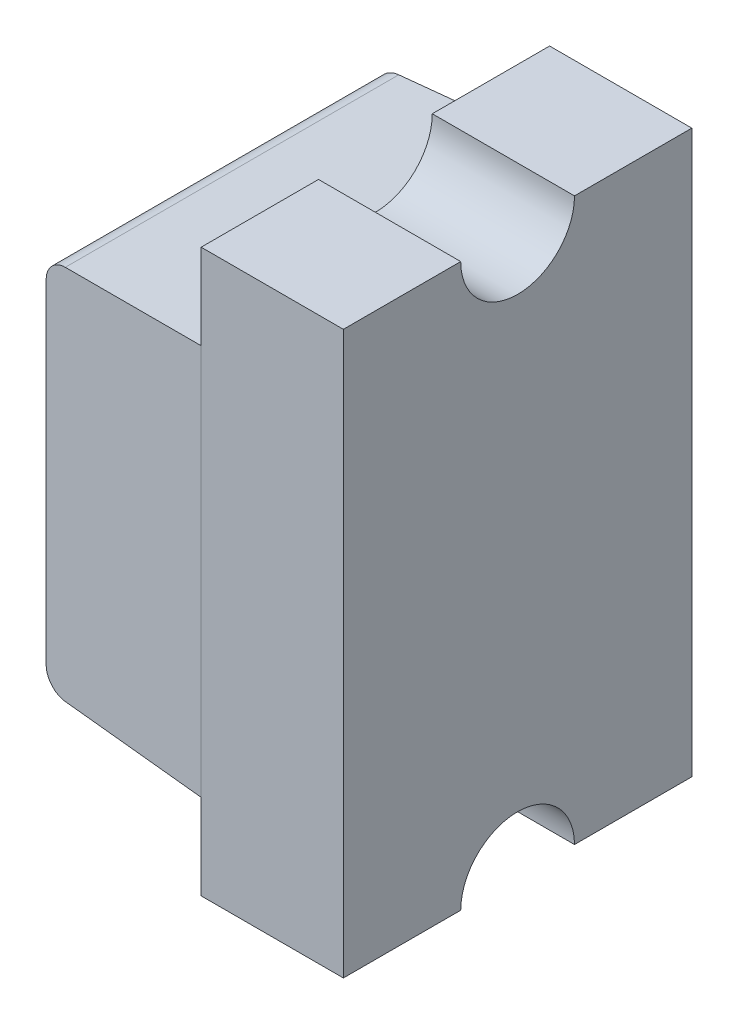
ISO-10303-21;
HEADER;
FILE_DESCRIPTION(('STEP AP214'),'2;1');
FILE_NAME('part.step','',(''),(''),'','','');
FILE_SCHEMA(('AUTOMOTIVE_DESIGN { 1 0 10303 214 1 1 1 1 }'));
ENDSEC;
DATA;
#1=APPLICATION_CONTEXT('core data for automotive mechanical design processes');
#2=APPLICATION_PROTOCOL_DEFINITION('international standard','automotive_design',2000,#1);
#3=PRODUCT_CONTEXT('',#1,'mechanical');
#4=PRODUCT('Part','Part','',(#3));
#5=PRODUCT_RELATED_PRODUCT_CATEGORY('part','',(#4));
#6=PRODUCT_DEFINITION_FORMATION('','',#4);
#7=PRODUCT_DEFINITION_CONTEXT('part definition',#1,'design');
#8=PRODUCT_DEFINITION('design','',#6,#7);
#9=PRODUCT_DEFINITION_SHAPE('','',#8);
#10=(LENGTH_UNIT() NAMED_UNIT(*) SI_UNIT(.MILLI.,.METRE.));
#11=(NAMED_UNIT(*) PLANE_ANGLE_UNIT() SI_UNIT($,.RADIAN.));
#12=(NAMED_UNIT(*) SI_UNIT($,.STERADIAN.) SOLID_ANGLE_UNIT());
#13=UNCERTAINTY_MEASURE_WITH_UNIT(LENGTH_MEASURE(1.E-05),#10,'distance_accuracy_value','');
#14=(GEOMETRIC_REPRESENTATION_CONTEXT(3) GLOBAL_UNCERTAINTY_ASSIGNED_CONTEXT((#13)) GLOBAL_UNIT_ASSIGNED_CONTEXT((#10,
#11,#12)) REPRESENTATION_CONTEXT('',''));
#15=CARTESIAN_POINT('',(0.,0.,0.));
#16=DIRECTION('',(0.,0.,1.));
#17=DIRECTION('',(1.,0.,0.));
#18=AXIS2_PLACEMENT_3D('',#15,#16,#17);
#19=CARTESIAN_POINT('',(-0.508,0.5955722658,-0.6026134506));
#20=DIRECTION('',(0.,0.,1.));
#21=DIRECTION('',(1.,0.,0.));
#22=AXIS2_PLACEMENT_3D('',#19,#20,#21);
#23=CYLINDRICAL_SURFACE('',#22,0.0762);
#24=CARTESIAN_POINT('',(-0.508,0.5955722658,0.595676846434782));
#25=DIRECTION('',(-0.05233595955494,0.,0.998629534581));
#26=DIRECTION('',(0.998629534581,0.,0.05233595955494));
#27=AXIS2_PLACEMENT_3D('',#24,#25,#26);
#28=ELLIPSE('',#27,0.0763045727783043,0.0762);
#29=CARTESIAN_POINT('',(-0.51198800073553,0.671667841415941,0.595467844159192));
#30=VERTEX_POINT('',#29);
#31=CARTESIAN_POINT('',(-0.5842,0.5955722666405,0.5916833734));
#32=VERTEX_POINT('',#31);
#33=EDGE_CURVE('E99',#30,#32,#28,.T.);
#34=ORIENTED_EDGE('',*,*,#33,.F.);
#35=DIRECTION('',(0.,0.,1.));
#36=VECTOR('',#35,1.);
#37=CARTESIAN_POINT('',(-0.511988000946234,0.671667846518126,-0.6297676));
#38=LINE('',#37,#36);
#39=CARTESIAN_POINT('',(-0.51198800073553,0.671667841415941,-0.595467844159194));
#40=VERTEX_POINT('',#39);
#41=EDGE_CURVE('E94',#40,#30,#38,.T.);
#42=ORIENTED_EDGE('',*,*,#41,.F.);
#43=CARTESIAN_POINT('',(-0.508,0.5955722658,-0.595676846434785));
#44=DIRECTION('',(-0.05233595955494,0.,-0.998629534581));
#45=DIRECTION('',(-0.998629534581,0.,0.05233595955494));
#46=AXIS2_PLACEMENT_3D('',#43,#44,#45);
#47=ELLIPSE('',#46,0.0763045727783043,0.0762);
#48=CARTESIAN_POINT('',(-0.5842,0.5955722666405,-0.591683373400002));
#49=VERTEX_POINT('',#48);
#50=EDGE_CURVE('E20',#49,#40,#47,.T.);
#51=ORIENTED_EDGE('',*,*,#50,.F.);
#52=DIRECTION('',(0.,0.,-1.));
#53=VECTOR('',#52,1.);
#54=CARTESIAN_POINT('',(-0.5842,0.595572267481,0.5916833734));
#55=LINE('',#54,#53);
#56=EDGE_CURVE('E89',#49,#32,#55,.F.);
#57=ORIENTED_EDGE('',*,*,#56,.T.);
#58=EDGE_LOOP('',(#34,#42,#51,#57));
#59=FACE_BOUND('',#58,.T.);
#60=ADVANCED_FACE('F17',(#59),#23,.T.);
#61=CARTESIAN_POINT('',(-0.5842,-0.5955722658,0.5916833734));
#62=DIRECTION('',(1.,0.,0.));
#63=DIRECTION('',(0.,0.,-1.));
#64=AXIS2_PLACEMENT_3D('',#61,#62,#63);
#65=PLANE('',#64);
#66=ORIENTED_EDGE('',*,*,#56,.F.);
#67=DIRECTION('',(0.,1.,0.));
#68=VECTOR('',#67,1.);
#69=CARTESIAN_POINT('',(-0.5842,-0.706882,-0.591683373400002));
#70=LINE('',#69,#68);
#71=CARTESIAN_POINT('',(-0.5842,-0.5955722658,-0.591683373400002));
#72=VERTEX_POINT('',#71);
#73=EDGE_CURVE('E120',#72,#49,#70,.T.);
#74=ORIENTED_EDGE('',*,*,#73,.F.);
#75=DIRECTION('',(0.,0.,-1.));
#76=VECTOR('',#75,1.);
#77=CARTESIAN_POINT('',(-0.5842,-0.5955722658,0.6026134506));
#78=LINE('',#77,#76);
#79=CARTESIAN_POINT('',(-0.5842,-0.5955722658,0.5916833734));
#80=VERTEX_POINT('',#79);
#81=EDGE_CURVE('E104',#80,#72,#78,.T.);
#82=ORIENTED_EDGE('',*,*,#81,.F.);
#83=DIRECTION('',(0.,1.,0.));
#84=VECTOR('',#83,1.);
#85=CARTESIAN_POINT('',(-0.5842,-0.706882,0.5916833734));
#86=LINE('',#85,#84);
#87=EDGE_CURVE('E294',#32,#80,#86,.F.);
#88=ORIENTED_EDGE('',*,*,#87,.F.);
#89=EDGE_LOOP('',(#66,#74,#82,#88));
#90=FACE_BOUND('',#89,.T.);
#91=ADVANCED_FACE('F199',(#90),#65,.F.);
#92=CARTESIAN_POINT('',(-0.508,-0.5955722658,0.6026134506));
#93=DIRECTION('',(0.,0.,-1.));
#94=DIRECTION('',(-1.,0.,0.));
#95=AXIS2_PLACEMENT_3D('',#92,#93,#94);
#96=CYLINDRICAL_SURFACE('',#95,0.0762);
#97=CARTESIAN_POINT('',(-0.508,-0.5955722658,-0.595676846434785));
#98=DIRECTION('',(-0.05233595955494,0.,-0.998629534581));
#99=DIRECTION('',(0.998629534581,0.,-0.05233595955494));
#100=AXIS2_PLACEMENT_3D('',#97,#98,#99);
#101=ELLIPSE('',#100,0.0763045727783043,0.0762);
#102=CARTESIAN_POINT('',(-0.511988000992492,-0.671667841402469,-0.595467844145727));
#103=VERTEX_POINT('',#102);
#104=EDGE_CURVE('E304',#103,#72,#101,.T.);
#105=ORIENTED_EDGE('',*,*,#104,.F.);
#106=DIRECTION('',(0.,0.,1.));
#107=VECTOR('',#106,1.);
#108=CARTESIAN_POINT('',(-0.51198800094935,-0.671667846517952,-0.6297676));
#109=LINE('',#108,#107);
#110=CARTESIAN_POINT('',(-0.511988000992492,-0.671667841402469,0.595467844145725));
#111=VERTEX_POINT('',#110);
#112=EDGE_CURVE('E103',#111,#103,#109,.F.);
#113=ORIENTED_EDGE('',*,*,#112,.F.);
#114=CARTESIAN_POINT('',(-0.508,-0.5955722658,0.595676846434782));
#115=DIRECTION('',(-0.05233595955494,0.,0.998629534581));
#116=DIRECTION('',(-0.998629534581,0.,-0.05233595955494));
#117=AXIS2_PLACEMENT_3D('',#114,#115,#116);
#118=ELLIPSE('',#117,0.0763045727783043,0.0762);
#119=EDGE_CURVE('E176',#80,#111,#118,.T.);
#120=ORIENTED_EDGE('',*,*,#119,.F.);
#121=ORIENTED_EDGE('',*,*,#81,.T.);
#122=EDGE_LOOP('',(#105,#113,#120,#121));
#123=FACE_BOUND('',#122,.T.);
#124=ADVANCED_FACE('F197',(#123),#96,.T.);
#125=CARTESIAN_POINT('',(0.,0.6985,-0.6297676));
#126=DIRECTION('',(-0.0523359549449789,0.998629534822597,0.));
#127=DIRECTION('',(-0.998629534822597,-0.0523359549449789,0.));
#128=AXIS2_PLACEMENT_3D('',#125,#126,#127);
#129=PLANE('',#128);
#130=DIRECTION('',(-0.997264688009913,-0.0522644363176922,-0.0522644309725482));
#131=VECTOR('',#130,1.);
#132=CARTESIAN_POINT('',(0.,0.698500000001,0.622299999999998));
#133=LINE('',#132,#131);
#134=CARTESIAN_POINT('',(0.,0.698500000001,0.622299999999999));
#135=VERTEX_POINT('',#134);
#136=EDGE_CURVE('E297',#135,#30,#133,.T.);
#137=ORIENTED_EDGE('',*,*,#136,.F.);
#138=DIRECTION('',(0.,0.,-1.));
#139=VECTOR('',#138,1.);
#140=CARTESIAN_POINT('',(0.,0.698500000001,0.6223));
#141=LINE('',#140,#139);
#142=CARTESIAN_POINT('',(0.,0.698500000001,-0.6223));
#143=VERTEX_POINT('',#142);
#144=EDGE_CURVE('E111',#135,#143,#141,.T.);
#145=ORIENTED_EDGE('',*,*,#144,.T.);
#146=DIRECTION('',(0.997264688009913,0.0522644363176922,-0.0522644309725482));
#147=VECTOR('',#146,1.);
#148=CARTESIAN_POINT('',(-0.511988000679008,0.671667841419001,-0.595467844162156));
#149=LINE('',#148,#147);
#150=EDGE_CURVE('E108',#40,#143,#149,.T.);
#151=ORIENTED_EDGE('',*,*,#150,.F.);
#152=ORIENTED_EDGE('',*,*,#41,.T.);
#153=EDGE_LOOP('',(#137,#145,#151,#152));
#154=FACE_BOUND('',#153,.T.);
#155=ADVANCED_FACE('F109',(#154),#129,.T.);
#156=CARTESIAN_POINT('',(-0.5119880032,-0.6716678464,-0.6297676));
#157=DIRECTION('',(-0.0523359549449789,-0.998629534822597,0.));
#158=DIRECTION('',(0.998629534822597,-0.0523359549449789,0.));
#159=AXIS2_PLACEMENT_3D('',#156,#157,#158);
#160=PLANE('',#159);
#161=DIRECTION('',(-0.997264687660036,0.0522644430120874,0.052264430954212));
#162=VECTOR('',#161,1.);
#163=CARTESIAN_POINT('',(0.,-0.698500000001,-0.6223));
#164=LINE('',#163,#162);
#165=CARTESIAN_POINT('',(0.,-0.698500000001,-0.6223));
#166=VERTEX_POINT('',#165);
#167=EDGE_CURVE('E115',#166,#103,#164,.T.);
#168=ORIENTED_EDGE('',*,*,#167,.F.);
#169=DIRECTION('',(0.,0.,-1.));
#170=VECTOR('',#169,1.);
#171=CARTESIAN_POINT('',(0.,-0.698500000001,0.6223));
#172=LINE('',#171,#170);
#173=CARTESIAN_POINT('',(0.,-0.698500000001,0.622299999999999));
#174=VERTEX_POINT('',#173);
#175=EDGE_CURVE('E275',#166,#174,#172,.F.);
#176=ORIENTED_EDGE('',*,*,#175,.T.);
#177=DIRECTION('',(0.997264687660036,-0.0522644430120874,0.052264430954212));
#178=VECTOR('',#177,1.);
#179=CARTESIAN_POINT('',(-0.511988000502232,-0.671667837982,0.595467844171418));
#180=LINE('',#179,#178);
#181=EDGE_CURVE('E299',#111,#174,#180,.T.);
#182=ORIENTED_EDGE('',*,*,#181,.F.);
#183=ORIENTED_EDGE('',*,*,#112,.T.);
#184=EDGE_LOOP('',(#168,#176,#182,#183));
#185=FACE_BOUND('',#184,.T.);
#186=ADVANCED_FACE('F191',(#185),#160,.T.);
#187=CARTESIAN_POINT('',(0.,-0.706882,-0.6223));
#188=DIRECTION('',(-0.05233595955494,0.,-0.998629534581));
#189=DIRECTION('',(-0.998629534581,0.,0.05233595955494));
#190=AXIS2_PLACEMENT_3D('',#187,#188,#189);
#191=PLANE('',#190);
#192=ORIENTED_EDGE('',*,*,#167,.T.);
#193=ORIENTED_EDGE('',*,*,#104,.T.);
#194=ORIENTED_EDGE('',*,*,#73,.T.);
#195=ORIENTED_EDGE('',*,*,#50,.T.);
#196=ORIENTED_EDGE('',*,*,#150,.T.);
#197=DIRECTION('',(0.,1.,0.));
#198=VECTOR('',#197,1.);
#199=CARTESIAN_POINT('',(0.,-1.0033,-0.6223));
#200=LINE('',#199,#198);
#201=EDGE_CURVE('E264',#143,#166,#200,.F.);
#202=ORIENTED_EDGE('',*,*,#201,.T.);
#203=EDGE_LOOP('',(#192,#193,#194,#195,#196,#202));
#204=FACE_BOUND('',#203,.T.);
#205=ADVANCED_FACE('F118',(#204),#191,.T.);
#206=CARTESIAN_POINT('',(-0.5842,-0.706882,0.5916833734));
#207=DIRECTION('',(-0.05233595955494,0.,0.998629534581));
#208=DIRECTION('',(0.998629534581,0.,0.05233595955494));
#209=AXIS2_PLACEMENT_3D('',#206,#207,#208);
#210=PLANE('',#209);
#211=ORIENTED_EDGE('',*,*,#87,.T.);
#212=ORIENTED_EDGE('',*,*,#119,.T.);
#213=ORIENTED_EDGE('',*,*,#181,.T.);
#214=DIRECTION('',(0.,1.,0.));
#215=VECTOR('',#214,1.);
#216=CARTESIAN_POINT('',(0.,-1.0033,0.6223));
#217=LINE('',#216,#215);
#218=EDGE_CURVE('E247',#174,#135,#217,.T.);
#219=ORIENTED_EDGE('',*,*,#218,.T.);
#220=ORIENTED_EDGE('',*,*,#136,.T.);
#221=ORIENTED_EDGE('',*,*,#33,.T.);
#222=EDGE_LOOP('',(#211,#212,#213,#219,#220,#221));
#223=FACE_BOUND('',#222,.T.);
#224=ADVANCED_FACE('F184',(#223),#210,.T.);
#225=CARTESIAN_POINT('',(0.,0.6985,0.6223));
#226=DIRECTION('',(1.,0.,0.));
#227=DIRECTION('',(0.,0.,-1.));
#228=AXIS2_PLACEMENT_3D('',#225,#226,#227);
#229=PLANE('',#228);
#230=CARTESIAN_POINT('',(0.,1.003299999955,-0.2032));
#231=CARTESIAN_POINT('',(0.,0.991868068119596,-0.203208745749555));
#232=CARTESIAN_POINT('',(0.,0.980439857536562,-0.202235459793719));
#233=CARTESIAN_POINT('',(0.,0.957914853362731,-0.198393473133915));
#234=CARTESIAN_POINT('',(0.,0.946817823420749,-0.195526159656413));
#235=CARTESIAN_POINT('',(0.,0.925256500036547,-0.187962826322631));
#236=CARTESIAN_POINT('',(0.,0.914792502762828,-0.183265958025452));
#237=CARTESIAN_POINT('',(0.,0.894809602660418,-0.172195417153839));
#238=CARTESIAN_POINT('',(0.,0.885290514664541,-0.165822074003349));
#239=CARTESIAN_POINT('',(0.,0.858567958214,-0.144423995327011));
#240=CARTESIAN_POINT('',(0.,0.843121155456059,-0.127093201544609));
#241=CARTESIAN_POINT('',(0.,0.818871696972281,-0.0883293456556855));
#242=CARTESIAN_POINT('',(0.,0.81006904124662,-0.0668962835490544));
#243=CARTESIAN_POINT('',(0.,0.800043664529715,-0.0223157420920966));
#244=CARTESIAN_POINT('',(0.,0.798820943538457,0.000831737258227252));
#245=CARTESIAN_POINT('',(0.,0.804112550352855,0.0462247378102939));
#246=CARTESIAN_POINT('',(0.,0.810626878158466,0.0684702590120417));
#247=CARTESIAN_POINT('',(0.,0.830637740294995,0.109549456160656));
#248=CARTESIAN_POINT('',(0.,0.84413427462589,0.128383132107533));
#249=CARTESIAN_POINT('',(0.,0.876650261312739,0.160529450697962));
#250=CARTESIAN_POINT('',(0.,0.895669713668694,0.173842093341513));
#251=CARTESIAN_POINT('',(0.,0.926605784885545,0.188524709587335));
#252=CARTESIAN_POINT('',(0.,0.937344708512988,0.192540765164541));
#253=CARTESIAN_POINT('',(0.,0.959340948619303,0.19871337344539));
#254=CARTESIAN_POINT('',(0.,0.970597445507259,0.200872766180447));
#255=CARTESIAN_POINT('',(0.,0.989042720778078,0.202826568538122));
#256=CARTESIAN_POINT('',(0.,0.996173963304118,0.203204179740301));
#257=CARTESIAN_POINT('',(0.,1.0032999999995,0.2032));
#258=B_SPLINE_CURVE_WITH_KNOTS('',3,(#230,#231,#232,#233,#234,#235,#236,#237,#238,#239,#240,
#241,#242,#243,#244,#245,#246,#247,#248,#249,#250,#251,#252,#253,#254,#255,#256,#257),
.UNSPECIFIED.,.F.,.F.,(4,2,2,2,2,2,2,2,2,2,2,2,2,4),(0.,0.0342485986817593,0.0684721407258852,
0.102711572585308,0.136944281484445,0.205173024269376,0.273401767056119,0.341630509842748,
0.409859252628996,0.478087995415032,0.546316738201085,0.580579059915287,0.614788878791298,
0.63617012959479),.UNSPECIFIED.);
#259=CARTESIAN_POINT('',(0.,1.00329999995675,-0.2032));
#260=VERTEX_POINT('',#259);
#261=CARTESIAN_POINT('',(0.,1.00329999999975,0.2032));
#262=VERTEX_POINT('',#261);
#263=EDGE_CURVE('E166',#260,#262,#258,.T.);
#264=ORIENTED_EDGE('',*,*,#263,.F.);
#265=DIRECTION('',(0.,0.,-1.));
#266=VECTOR('',#265,1.);
#267=CARTESIAN_POINT('',(0.,1.0033,-0.2032));
#268=LINE('',#267,#266);
#269=CARTESIAN_POINT('',(0.,1.0033,-0.6223));
#270=VERTEX_POINT('',#269);
#271=EDGE_CURVE('E253',#260,#270,#268,.T.);
#272=ORIENTED_EDGE('',*,*,#271,.T.);
#273=DIRECTION('',(0.,1.,0.));
#274=VECTOR('',#273,1.);
#275=CARTESIAN_POINT('',(0.,-1.0033,-0.6223));
#276=LINE('',#275,#274);
#277=EDGE_CURVE('E263',#270,#143,#276,.F.);
#278=ORIENTED_EDGE('',*,*,#277,.T.);
#279=ORIENTED_EDGE('',*,*,#144,.F.);
#280=DIRECTION('',(0.,1.,0.));
#281=VECTOR('',#280,1.);
#282=CARTESIAN_POINT('',(0.,-1.0033,0.6223));
#283=LINE('',#282,#281);
#284=CARTESIAN_POINT('',(0.,1.0033,0.6223));
#285=VERTEX_POINT('',#284);
#286=EDGE_CURVE('E242',#135,#285,#283,.T.);
#287=ORIENTED_EDGE('',*,*,#286,.T.);
#288=DIRECTION('',(0.,0.,-1.));
#289=VECTOR('',#288,1.);
#290=CARTESIAN_POINT('',(0.,1.0033,0.6223));
#291=LINE('',#290,#289);
#292=EDGE_CURVE('E248',#285,#262,#291,.T.);
#293=ORIENTED_EDGE('',*,*,#292,.T.);
#294=EDGE_LOOP('',(#264,#272,#278,#279,#287,#293));
#295=FACE_BOUND('',#294,.T.);
#296=ADVANCED_FACE('F178',(#295),#229,.F.);
#297=CARTESIAN_POINT('',(0.,-1.0033,0.6223));
#298=DIRECTION('',(1.,0.,0.));
#299=DIRECTION('',(0.,0.,-1.));
#300=AXIS2_PLACEMENT_3D('',#297,#298,#299);
#301=PLANE('',#300);
#302=CARTESIAN_POINT('',(0.,-1.0033,0.));
#303=DIRECTION('',(-1.,0.,0.));
#304=DIRECTION('',(0.,0.,1.));
#305=AXIS2_PLACEMENT_3D('',#302,#303,#304);
#306=CIRCLE('',#305,0.2032);
#307=CARTESIAN_POINT('',(0.,-1.0033,-0.2032));
#308=VERTEX_POINT('',#307);
#309=CARTESIAN_POINT('',(0.,-1.0033,0.2032));
#310=VERTEX_POINT('',#309);
#311=EDGE_CURVE('E143',#308,#310,#306,.F.);
#312=ORIENTED_EDGE('',*,*,#311,.T.);
#313=DIRECTION('',(0.,0.,1.));
#314=VECTOR('',#313,1.);
#315=CARTESIAN_POINT('',(0.,-1.0033,0.2032));
#316=LINE('',#315,#314);
#317=CARTESIAN_POINT('',(0.,-1.0033,0.6223));
#318=VERTEX_POINT('',#317);
#319=EDGE_CURVE('E226',#310,#318,#316,.T.);
#320=ORIENTED_EDGE('',*,*,#319,.T.);
#321=DIRECTION('',(0.,1.,0.));
#322=VECTOR('',#321,1.);
#323=CARTESIAN_POINT('',(0.,-1.0033,0.6223));
#324=LINE('',#323,#322);
#325=EDGE_CURVE('E241',#318,#174,#324,.T.);
#326=ORIENTED_EDGE('',*,*,#325,.T.);
#327=ORIENTED_EDGE('',*,*,#175,.F.);
#328=DIRECTION('',(0.,1.,0.));
#329=VECTOR('',#328,1.);
#330=CARTESIAN_POINT('',(0.,-1.0033,-0.6223));
#331=LINE('',#330,#329);
#332=CARTESIAN_POINT('',(0.,-1.0033,-0.6223));
#333=VERTEX_POINT('',#332);
#334=EDGE_CURVE('E260',#166,#333,#331,.F.);
#335=ORIENTED_EDGE('',*,*,#334,.T.);
#336=DIRECTION('',(0.,0.,1.));
#337=VECTOR('',#336,1.);
#338=CARTESIAN_POINT('',(0.,-1.0033,-0.6223));
#339=LINE('',#338,#337);
#340=EDGE_CURVE('E256',#333,#308,#339,.T.);
#341=ORIENTED_EDGE('',*,*,#340,.T.);
#342=EDGE_LOOP('',(#312,#320,#326,#327,#335,#341));
#343=FACE_BOUND('',#342,.T.);
#344=ADVANCED_FACE('F183',(#343),#301,.F.);
#345=CARTESIAN_POINT('',(0.,-1.0033,-0.6223));
#346=DIRECTION('',(0.,0.,1.));
#347=DIRECTION('',(1.,0.,0.));
#348=AXIS2_PLACEMENT_3D('',#345,#346,#347);
#349=PLANE('',#348);
#350=DIRECTION('',(1.,0.,0.));
#351=VECTOR('',#350,1.);
#352=CARTESIAN_POINT('',(0.,1.0033,-0.6223));
#353=LINE('',#352,#351);
#354=CARTESIAN_POINT('',(0.508,1.0033,-0.6223));
#355=VERTEX_POINT('',#354);
#356=EDGE_CURVE('E175',#270,#355,#353,.T.);
#357=ORIENTED_EDGE('',*,*,#356,.T.);
#358=DIRECTION('',(0.,1.,0.));
#359=VECTOR('',#358,1.);
#360=CARTESIAN_POINT('',(0.508,-1.0033,-0.6223));
#361=LINE('',#360,#359);
#362=CARTESIAN_POINT('',(0.508,-1.0033,-0.6223));
#363=VERTEX_POINT('',#362);
#364=EDGE_CURVE('E342',#363,#355,#361,.T.);
#365=ORIENTED_EDGE('',*,*,#364,.F.);
#366=DIRECTION('',(1.,0.,0.));
#367=VECTOR('',#366,1.);
#368=CARTESIAN_POINT('',(0.,-1.0033,-0.6223));
#369=LINE('',#368,#367);
#370=EDGE_CURVE('E224',#363,#333,#369,.F.);
#371=ORIENTED_EDGE('',*,*,#370,.T.);
#372=ORIENTED_EDGE('',*,*,#334,.F.);
#373=ORIENTED_EDGE('',*,*,#201,.F.);
#374=ORIENTED_EDGE('',*,*,#277,.F.);
#375=EDGE_LOOP('',(#357,#365,#371,#372,#373,#374));
#376=FACE_BOUND('',#375,.T.);
#377=ADVANCED_FACE('F344',(#376),#349,.F.);
#378=CARTESIAN_POINT('',(0.,1.0033,-0.2032));
#379=DIRECTION('',(0.,-1.,0.));
#380=DIRECTION('',(0.,0.,-1.));
#381=AXIS2_PLACEMENT_3D('',#378,#379,#380);
#382=PLANE('',#381);
#383=ORIENTED_EDGE('',*,*,#356,.F.);
#384=ORIENTED_EDGE('',*,*,#271,.F.);
#385=DIRECTION('',(-1.,0.,0.));
#386=VECTOR('',#385,1.);
#387=CARTESIAN_POINT('',(0.254,1.003299999917,-0.2032));
#388=LINE('',#387,#386);
#389=CARTESIAN_POINT('',(0.508,1.00329999993775,-0.2032));
#390=VERTEX_POINT('',#389);
#391=EDGE_CURVE('E174',#390,#260,#388,.T.);
#392=ORIENTED_EDGE('',*,*,#391,.F.);
#393=DIRECTION('',(0.,0.,-1.));
#394=VECTOR('',#393,1.);
#395=CARTESIAN_POINT('',(0.508,1.0033,0.6223));
#396=LINE('',#395,#394);
#397=EDGE_CURVE('E142',#355,#390,#396,.F.);
#398=ORIENTED_EDGE('',*,*,#397,.F.);
#399=EDGE_LOOP('',(#383,#384,#392,#398));
#400=FACE_BOUND('',#399,.T.);
#401=ADVANCED_FACE('F156',(#400),#382,.F.);
#402=CARTESIAN_POINT('',(0.508,1.003299999917,-0.2032));
#403=CARTESIAN_POINT('',(0.508,0.596900000083,-0.203199999833));
#404=CARTESIAN_POINT('',(0.508,0.596900000167,0.2032));
#405=CARTESIAN_POINT('',(0.508,1.0033,0.2032));
#406=CARTESIAN_POINT('',(0.,1.003299999917,-0.2032));
#407=CARTESIAN_POINT('',(0.,0.596900000083,-0.203199999833));
#408=CARTESIAN_POINT('',(0.,0.596900000167,0.2032));
#409=CARTESIAN_POINT('',(0.,1.0033,0.2032));
#410=(BOUNDED_SURFACE() B_SPLINE_SURFACE(1,3,((#402,#403,#404,#405),(#406,#407,#408,#409)),
.UNSPECIFIED.,.F.,.F.,.F.) B_SPLINE_SURFACE_WITH_KNOTS((2,2),(4,4),(0.,1.),(0.,1.),
.UNSPECIFIED.) GEOMETRIC_REPRESENTATION_ITEM() RATIONAL_B_SPLINE_SURFACE(((1.,0.33333333347,
0.33333333347,1.),(1.,0.33333333347,0.33333333347,1.))) REPRESENTATION_ITEM('') SURFACE());
#411=CARTESIAN_POINT('',(0.508,1.00329999995,-0.2032));
#412=CARTESIAN_POINT('',(0.508,0.991868068115131,-0.203208745749272));
#413=CARTESIAN_POINT('',(0.508,0.980439857532655,-0.202235459793247));
#414=CARTESIAN_POINT('',(0.508,0.957914853359944,-0.198393473133247));
#415=CARTESIAN_POINT('',(0.508,0.946817823418521,-0.195526159655738));
#416=CARTESIAN_POINT('',(0.508,0.925256500035444,-0.187962826322137));
#417=CARTESIAN_POINT('',(0.508,0.914792502762285,-0.183265958025154));
#418=CARTESIAN_POINT('',(0.508,0.8948096026609,-0.172195417154104));
#419=CARTESIAN_POINT('',(0.508,0.885290514665486,-0.165822074003982));
#420=CARTESIAN_POINT('',(0.508,0.858567958215222,-0.144423995328235));
#421=CARTESIAN_POINT('',(0.508,0.843121155457134,-0.127093201545963));
#422=CARTESIAN_POINT('',(0.508,0.818871696973027,-0.0883293456572439));
#423=CARTESIAN_POINT('',(0.508,0.810069041247185,-0.0668962835506874));
#424=CARTESIAN_POINT('',(0.508,0.800043664529903,-0.0223157420938145));
#425=CARTESIAN_POINT('',(0.508,0.79882094353845,0.000831737256499156));
#426=CARTESIAN_POINT('',(0.508,0.804112550352464,0.0462247378086106));
#427=CARTESIAN_POINT('',(0.508,0.810626878157887,0.0684702590104134));
#428=CARTESIAN_POINT('',(0.508,0.830637740294069,0.109549456159197));
#429=CARTESIAN_POINT('',(0.508,0.844134274624805,0.128383132106188));
#430=CARTESIAN_POINT('',(0.508,0.876650261311382,0.160529450696892));
#431=CARTESIAN_POINT('',(0.508,0.895669713667225,0.173842093340603));
#432=CARTESIAN_POINT('',(0.508,0.926605784883951,0.188524709586687));
#433=CARTESIAN_POINT('',(0.508,0.93734470851136,0.192540765163983));
#434=CARTESIAN_POINT('',(0.508,0.959340948617622,0.198713373445019));
#435=CARTESIAN_POINT('',(0.508,0.97059744550556,0.20087276618017));
#436=CARTESIAN_POINT('',(0.508,0.989042720777099,0.202826568538079));
#437=CARTESIAN_POINT('',(0.508,0.996173963303879,0.203204179740319));
#438=CARTESIAN_POINT('',(0.508,1.0033,0.2032));
#439=B_SPLINE_CURVE_WITH_KNOTS('',3,(#411,#412,#413,#414,#415,#416,#417,#418,#419,#420,#421,
#422,#423,#424,#425,#426,#427,#428,#429,#430,#431,#432,#433,#434,#435,#436,#437,#438),
.UNSPECIFIED.,.F.,.F.,(4,2,2,2,2,2,2,2,2,2,2,2,2,4),(0.,0.0342485986801601,0.068472140722687,
0.102711572580358,0.136944281477751,0.205173024262682,0.273401767049425,0.341630509836055,
0.409859252622302,0.478087995408339,0.546316738194392,0.580579059908592,0.614788878784604,
0.636170129590311),.UNSPECIFIED.);
#440=CARTESIAN_POINT('',(0.508,1.0033,0.2031999999875));
#441=VERTEX_POINT('',#440);
#442=EDGE_CURVE('E132',#390,#441,#439,.T.);
#443=DIRECTION('',(1.,0.,0.));
#444=VECTOR('',#443,1.);
#445=CARTESIAN_POINT('',(0.,1.0033,0.2032));
#446=LINE('',#445,#444);
#447=EDGE_CURVE('E245',#262,#441,#446,.T.);
#448=ORIENTED_EDGE('',*,*,#442,.F.);
#449=ORIENTED_EDGE('',*,*,#391,.T.);
#450=ORIENTED_EDGE('',*,*,#263,.T.);
#451=ORIENTED_EDGE('',*,*,#447,.T.);
#452=EDGE_LOOP('',(#448,#449,#450,#451));
#453=FACE_BOUND('',#452,.T.);
#454=ADVANCED_FACE('F148',(#453),#410,.T.);
#455=CARTESIAN_POINT('',(0.,1.0033,0.6223));
#456=DIRECTION('',(0.,-1.,0.));
#457=DIRECTION('',(0.,0.,-1.));
#458=AXIS2_PLACEMENT_3D('',#455,#456,#457);
#459=PLANE('',#458);
#460=ORIENTED_EDGE('',*,*,#447,.F.);
#461=ORIENTED_EDGE('',*,*,#292,.F.);
#462=DIRECTION('',(-1.,0.,0.));
#463=VECTOR('',#462,1.);
#464=CARTESIAN_POINT('',(0.508,1.0033,0.6223));
#465=LINE('',#464,#463);
#466=CARTESIAN_POINT('',(0.508,1.0033,0.6223));
#467=VERTEX_POINT('',#466);
#468=EDGE_CURVE('E238',#285,#467,#465,.F.);
#469=ORIENTED_EDGE('',*,*,#468,.T.);
#470=DIRECTION('',(0.,0.,-1.));
#471=VECTOR('',#470,1.);
#472=CARTESIAN_POINT('',(0.508,1.0033,0.6223));
#473=LINE('',#472,#471);
#474=EDGE_CURVE('E141',#441,#467,#473,.F.);
#475=ORIENTED_EDGE('',*,*,#474,.F.);
#476=EDGE_LOOP('',(#460,#461,#469,#475));
#477=FACE_BOUND('',#476,.T.);
#478=ADVANCED_FACE('F155',(#477),#459,.F.);
#479=CARTESIAN_POINT('',(0.508,-1.0033,0.6223));
#480=DIRECTION('',(0.,0.,-1.));
#481=DIRECTION('',(-1.,0.,0.));
#482=AXIS2_PLACEMENT_3D('',#479,#480,#481);
#483=PLANE('',#482);
#484=DIRECTION('',(1.,0.,0.));
#485=VECTOR('',#484,1.);
#486=CARTESIAN_POINT('',(0.,-1.0033,0.6223));
#487=LINE('',#486,#485);
#488=CARTESIAN_POINT('',(0.508,-1.0033,0.6223));
#489=VERTEX_POINT('',#488);
#490=EDGE_CURVE('E222',#318,#489,#487,.T.);
#491=ORIENTED_EDGE('',*,*,#490,.T.);
#492=DIRECTION('',(0.,1.,0.));
#493=VECTOR('',#492,1.);
#494=CARTESIAN_POINT('',(0.508,-1.0033,0.6223));
#495=LINE('',#494,#493);
#496=EDGE_CURVE('E234',#467,#489,#495,.F.);
#497=ORIENTED_EDGE('',*,*,#496,.F.);
#498=ORIENTED_EDGE('',*,*,#468,.F.);
#499=ORIENTED_EDGE('',*,*,#286,.F.);
#500=ORIENTED_EDGE('',*,*,#218,.F.);
#501=ORIENTED_EDGE('',*,*,#325,.F.);
#502=EDGE_LOOP('',(#491,#497,#498,#499,#500,#501));
#503=FACE_BOUND('',#502,.T.);
#504=ADVANCED_FACE('F375',(#503),#483,.F.);
#505=CARTESIAN_POINT('',(0.,-1.0033,0.2032));
#506=DIRECTION('',(0.,1.,0.));
#507=DIRECTION('',(0.,0.,1.));
#508=AXIS2_PLACEMENT_3D('',#505,#506,#507);
#509=PLANE('',#508);
#510=ORIENTED_EDGE('',*,*,#490,.F.);
#511=ORIENTED_EDGE('',*,*,#319,.F.);
#512=DIRECTION('',(-1.,0.,0.));
#513=VECTOR('',#512,1.);
#514=CARTESIAN_POINT('',(0.508,-1.0033,0.2032));
#515=LINE('',#514,#513);
#516=CARTESIAN_POINT('',(0.508,-1.0033,0.2032));
#517=VERTEX_POINT('',#516);
#518=EDGE_CURVE('E219',#310,#517,#515,.F.);
#519=ORIENTED_EDGE('',*,*,#518,.T.);
#520=DIRECTION('',(0.,0.,-1.));
#521=VECTOR('',#520,1.);
#522=CARTESIAN_POINT('',(0.508,-1.0033,0.6223));
#523=LINE('',#522,#521);
#524=EDGE_CURVE('E131',#489,#517,#523,.T.);
#525=ORIENTED_EDGE('',*,*,#524,.F.);
#526=EDGE_LOOP('',(#510,#511,#519,#525));
#527=FACE_BOUND('',#526,.T.);
#528=ADVANCED_FACE('F378',(#527),#509,.F.);
#529=CARTESIAN_POINT('',(0.508,-1.0033,0.));
#530=DIRECTION('',(-1.,0.,0.));
#531=DIRECTION('',(0.,0.,1.));
#532=AXIS2_PLACEMENT_3D('',#529,#530,#531);
#533=CYLINDRICAL_SURFACE('',#532,0.2032);
#534=DIRECTION('',(1.,0.,0.));
#535=VECTOR('',#534,1.);
#536=CARTESIAN_POINT('',(0.,-1.0033,-0.2032));
#537=LINE('',#536,#535);
#538=CARTESIAN_POINT('',(0.508,-1.0033,-0.2032));
#539=VERTEX_POINT('',#538);
#540=EDGE_CURVE('E35',#308,#539,#537,.T.);
#541=ORIENTED_EDGE('',*,*,#540,.T.);
#542=CARTESIAN_POINT('',(0.508,-1.0033,0.));
#543=DIRECTION('',(-1.,0.,0.));
#544=DIRECTION('',(0.,0.,1.));
#545=AXIS2_PLACEMENT_3D('',#542,#543,#544);
#546=CIRCLE('',#545,0.2032);
#547=EDGE_CURVE('E26',#517,#539,#546,.T.);
#548=ORIENTED_EDGE('',*,*,#547,.F.);
#549=ORIENTED_EDGE('',*,*,#518,.F.);
#550=ORIENTED_EDGE('',*,*,#311,.F.);
#551=EDGE_LOOP('',(#541,#548,#549,#550));
#552=FACE_BOUND('',#551,.T.);
#553=ADVANCED_FACE('F212',(#552),#533,.F.);
#554=CARTESIAN_POINT('',(0.,-1.0033,-0.6223));
#555=DIRECTION('',(0.,1.,0.));
#556=DIRECTION('',(0.,0.,1.));
#557=AXIS2_PLACEMENT_3D('',#554,#555,#556);
#558=PLANE('',#557);
#559=ORIENTED_EDGE('',*,*,#540,.F.);
#560=ORIENTED_EDGE('',*,*,#340,.F.);
#561=ORIENTED_EDGE('',*,*,#370,.F.);
#562=DIRECTION('',(0.,0.,-1.));
#563=VECTOR('',#562,1.);
#564=CARTESIAN_POINT('',(0.508,-1.0033,0.6223));
#565=LINE('',#564,#563);
#566=EDGE_CURVE('E11',#539,#363,#565,.T.);
#567=ORIENTED_EDGE('',*,*,#566,.F.);
#568=EDGE_LOOP('',(#559,#560,#561,#567));
#569=FACE_BOUND('',#568,.T.);
#570=ADVANCED_FACE('F207',(#569),#558,.F.);
#571=CARTESIAN_POINT('',(0.508,-1.0033,0.6223));
#572=DIRECTION('',(1.,0.,0.));
#573=DIRECTION('',(0.,0.,-1.));
#574=AXIS2_PLACEMENT_3D('',#571,#572,#573);
#575=PLANE('',#574);
#576=ORIENTED_EDGE('',*,*,#547,.T.);
#577=ORIENTED_EDGE('',*,*,#566,.T.);
#578=ORIENTED_EDGE('',*,*,#364,.T.);
#579=ORIENTED_EDGE('',*,*,#397,.T.);
#580=ORIENTED_EDGE('',*,*,#442,.T.);
#581=ORIENTED_EDGE('',*,*,#474,.T.);
#582=ORIENTED_EDGE('',*,*,#496,.T.);
#583=ORIENTED_EDGE('',*,*,#524,.T.);
#584=EDGE_LOOP('',(#576,#577,#578,#579,#580,#581,#582,#583));
#585=FACE_BOUND('',#584,.T.);
#586=ADVANCED_FACE('F145',(#585),#575,.T.);
#587=CLOSED_SHELL('',(#60,#91,#124,#155,#186,#205,#224,#296,#344,#377,#401,#454,#478,#504,#528,
#553,#570,#586));
#588=MANIFOLD_SOLID_BREP('B1',#587);
#589=ADVANCED_BREP_SHAPE_REPRESENTATION('',(#18,#588),#14);
#590=SHAPE_DEFINITION_REPRESENTATION(#9,#589);
ENDSEC;
END-ISO-10303-21;
